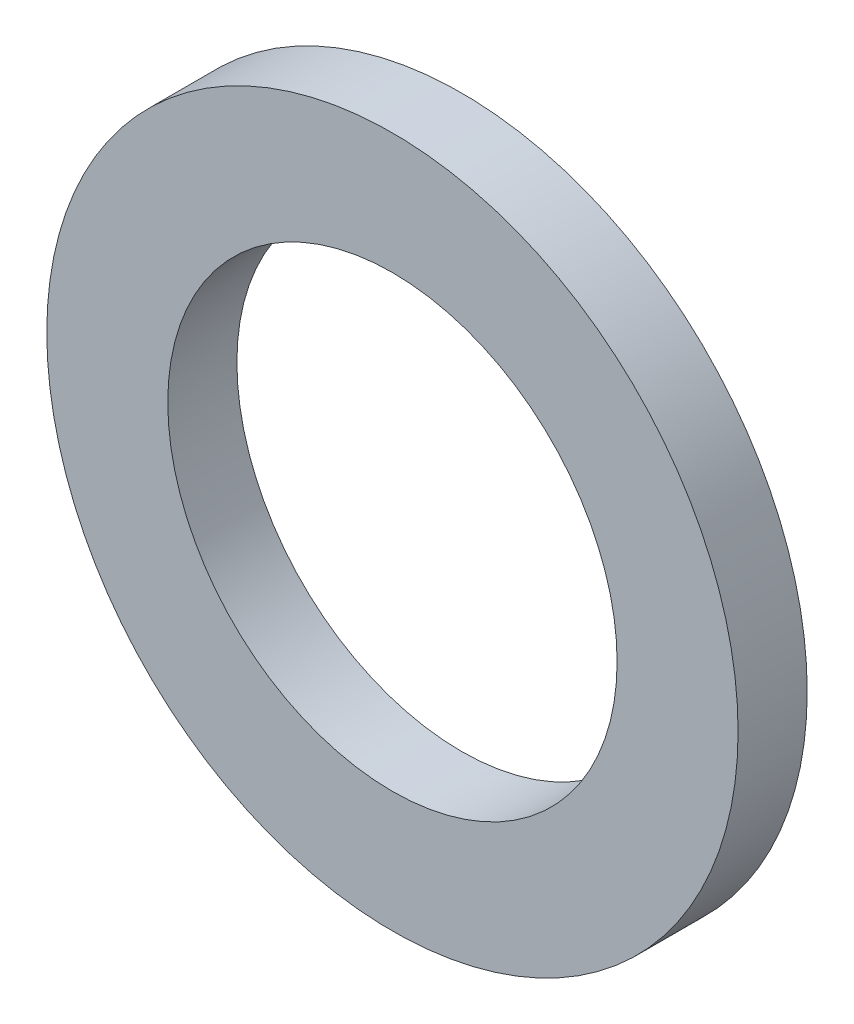
ISO-10303-21;
HEADER;
FILE_DESCRIPTION(('STEP AP214'),'2;1');
FILE_NAME('part.step','',(''),(''),'','','');
FILE_SCHEMA(('AUTOMOTIVE_DESIGN { 1 0 10303 214 1 1 1 1 }'));
ENDSEC;
DATA;
#1=APPLICATION_CONTEXT('core data for automotive mechanical design processes');
#2=APPLICATION_PROTOCOL_DEFINITION('international standard','automotive_design',2000,#1);
#3=PRODUCT_CONTEXT('',#1,'mechanical');
#4=PRODUCT('Part','Part','',(#3));
#5=PRODUCT_RELATED_PRODUCT_CATEGORY('part','',(#4));
#6=PRODUCT_DEFINITION_FORMATION('','',#4);
#7=PRODUCT_DEFINITION_CONTEXT('part definition',#1,'design');
#8=PRODUCT_DEFINITION('design','',#6,#7);
#9=PRODUCT_DEFINITION_SHAPE('','',#8);
#10=(LENGTH_UNIT() NAMED_UNIT(*) SI_UNIT(.MILLI.,.METRE.));
#11=(NAMED_UNIT(*) PLANE_ANGLE_UNIT() SI_UNIT($,.RADIAN.));
#12=(NAMED_UNIT(*) SI_UNIT($,.STERADIAN.) SOLID_ANGLE_UNIT());
#13=UNCERTAINTY_MEASURE_WITH_UNIT(LENGTH_MEASURE(1.E-05),#10,'distance_accuracy_value','');
#14=(GEOMETRIC_REPRESENTATION_CONTEXT(3) GLOBAL_UNCERTAINTY_ASSIGNED_CONTEXT((#13)) GLOBAL_UNIT_ASSIGNED_CONTEXT((#10,
#11,#12)) REPRESENTATION_CONTEXT('',''));
#15=CARTESIAN_POINT('',(0.,0.,0.));
#16=DIRECTION('',(0.,0.,1.));
#17=DIRECTION('',(1.,0.,0.));
#18=AXIS2_PLACEMENT_3D('',#15,#16,#17);
#19=CARTESIAN_POINT('',(0.,0.,1.));
#20=DIRECTION('',(0.,0.,1.));
#21=DIRECTION('',(1.,0.,0.));
#22=AXIS2_PLACEMENT_3D('',#19,#20,#21);
#23=PLANE('',#22);
#24=CARTESIAN_POINT('',(0.,0.,1.));
#25=DIRECTION('',(0.,0.,1.));
#26=DIRECTION('',(1.,0.,0.));
#27=AXIS2_PLACEMENT_3D('',#24,#25,#26);
#28=CIRCLE('',#27,5.);
#29=CARTESIAN_POINT('',(5.,0.,1.));
#30=VERTEX_POINT('',#29);
#31=EDGE_CURVE('E10',#30,#30,#28,.T.);
#32=ORIENTED_EDGE('',*,*,#31,.T.);
#33=EDGE_LOOP('',(#32));
#34=FACE_BOUND('',#33,.T.);
#35=CARTESIAN_POINT('',(0.,0.,1.));
#36=DIRECTION('',(0.,0.,1.));
#37=DIRECTION('',(1.,0.,0.));
#38=AXIS2_PLACEMENT_3D('',#35,#36,#37);
#39=CIRCLE('',#38,3.25);
#40=CARTESIAN_POINT('',(3.25,0.,1.));
#41=VERTEX_POINT('',#40);
#42=EDGE_CURVE('E44',#41,#41,#39,.T.);
#43=ORIENTED_EDGE('',*,*,#42,.F.);
#44=EDGE_LOOP('',(#43));
#45=FACE_BOUND('',#44,.T.);
#46=ADVANCED_FACE('F33',(#34,#45),#23,.T.);
#47=CARTESIAN_POINT('',(0.,0.,0.));
#48=DIRECTION('',(0.,0.,1.));
#49=DIRECTION('',(1.,0.,0.));
#50=AXIS2_PLACEMENT_3D('',#47,#48,#49);
#51=PLANE('',#50);
#52=CARTESIAN_POINT('',(0.,0.,0.));
#53=DIRECTION('',(0.,0.,1.));
#54=DIRECTION('',(1.,0.,0.));
#55=AXIS2_PLACEMENT_3D('',#52,#53,#54);
#56=CIRCLE('',#55,5.);
#57=CARTESIAN_POINT('',(5.,0.,0.));
#58=VERTEX_POINT('',#57);
#59=EDGE_CURVE('E37',#58,#58,#56,.T.);
#60=ORIENTED_EDGE('',*,*,#59,.F.);
#61=EDGE_LOOP('',(#60));
#62=FACE_BOUND('',#61,.T.);
#63=CARTESIAN_POINT('',(0.,0.,0.));
#64=DIRECTION('',(0.,0.,1.));
#65=DIRECTION('',(1.,0.,0.));
#66=AXIS2_PLACEMENT_3D('',#63,#64,#65);
#67=CIRCLE('',#66,3.25);
#68=CARTESIAN_POINT('',(3.25,0.,0.));
#69=VERTEX_POINT('',#68);
#70=EDGE_CURVE('E46',#69,#69,#67,.T.);
#71=ORIENTED_EDGE('',*,*,#70,.T.);
#72=EDGE_LOOP('',(#71));
#73=FACE_BOUND('',#72,.T.);
#74=ADVANCED_FACE('F56',(#62,#73),#51,.F.);
#75=CARTESIAN_POINT('',(0.,0.,1.));
#76=DIRECTION('',(0.,0.,-1.));
#77=DIRECTION('',(-1.,0.,0.));
#78=AXIS2_PLACEMENT_3D('',#75,#76,#77);
#79=CYLINDRICAL_SURFACE('',#78,5.);
#80=ORIENTED_EDGE('',*,*,#31,.F.);
#81=EDGE_LOOP('',(#80));
#82=FACE_BOUND('',#81,.T.);
#83=ORIENTED_EDGE('',*,*,#59,.T.);
#84=EDGE_LOOP('',(#83));
#85=FACE_BOUND('',#84,.T.);
#86=ADVANCED_FACE('F35',(#82,#85),#79,.T.);
#87=CARTESIAN_POINT('',(0.,0.,1.));
#88=DIRECTION('',(0.,0.,-1.));
#89=DIRECTION('',(-1.,0.,0.));
#90=AXIS2_PLACEMENT_3D('',#87,#88,#89);
#91=CYLINDRICAL_SURFACE('',#90,3.25);
#92=ORIENTED_EDGE('',*,*,#42,.T.);
#93=EDGE_LOOP('',(#92));
#94=FACE_BOUND('',#93,.T.);
#95=ORIENTED_EDGE('',*,*,#70,.F.);
#96=EDGE_LOOP('',(#95));
#97=FACE_BOUND('',#96,.T.);
#98=ADVANCED_FACE('F52',(#94,#97),#91,.F.);
#99=CLOSED_SHELL('',(#46,#74,#86,#98));
#100=MANIFOLD_SOLID_BREP('B2',#99);
#101=ADVANCED_BREP_SHAPE_REPRESENTATION('',(#18,#100),#14);
#102=SHAPE_DEFINITION_REPRESENTATION(#9,#101);
ENDSEC;
END-ISO-10303-21;
